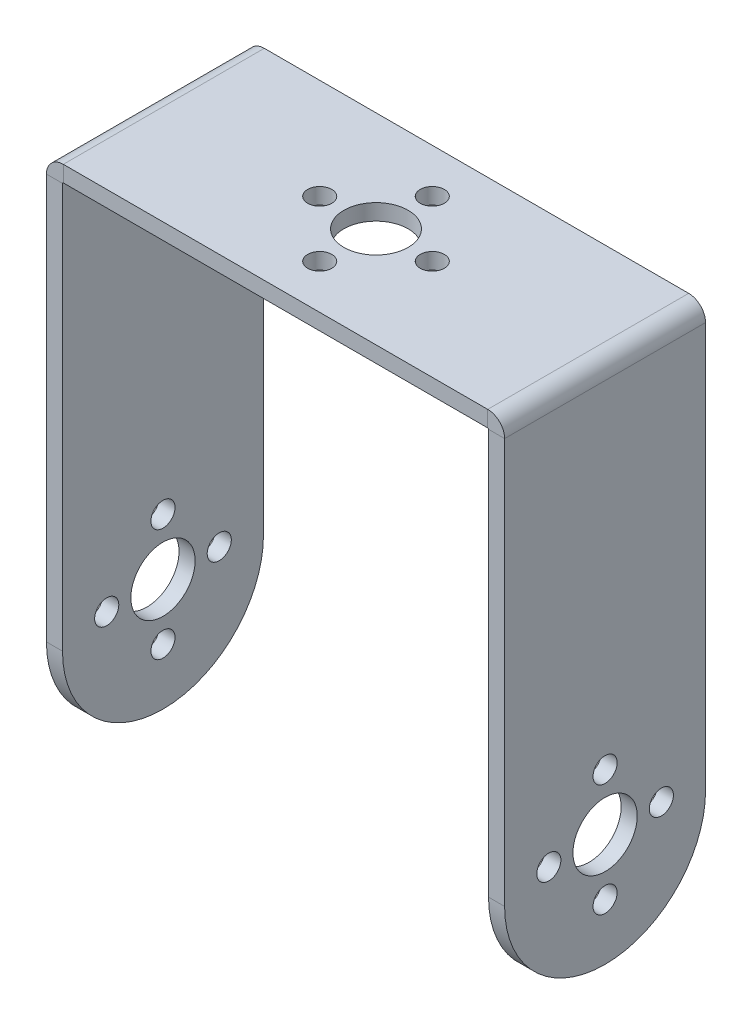
ISO-10303-21;
HEADER;
FILE_DESCRIPTION(('STEP AP214'),'2;1');
FILE_NAME('part.step','',(''),(''),'','','');
FILE_SCHEMA(('AUTOMOTIVE_DESIGN { 1 0 10303 214 1 1 1 1 }'));
ENDSEC;
DATA;
#1=APPLICATION_CONTEXT('core data for automotive mechanical design processes');
#2=APPLICATION_PROTOCOL_DEFINITION('international standard','automotive_design',2000,#1);
#3=PRODUCT_CONTEXT('',#1,'mechanical');
#4=PRODUCT('Part','Part','',(#3));
#5=PRODUCT_RELATED_PRODUCT_CATEGORY('part','',(#4));
#6=PRODUCT_DEFINITION_FORMATION('','',#4);
#7=PRODUCT_DEFINITION_CONTEXT('part definition',#1,'design');
#8=PRODUCT_DEFINITION('design','',#6,#7);
#9=PRODUCT_DEFINITION_SHAPE('','',#8);
#10=(LENGTH_UNIT() NAMED_UNIT(*) SI_UNIT(.MILLI.,.METRE.));
#11=(NAMED_UNIT(*) PLANE_ANGLE_UNIT() SI_UNIT($,.RADIAN.));
#12=(NAMED_UNIT(*) SI_UNIT($,.STERADIAN.) SOLID_ANGLE_UNIT());
#13=UNCERTAINTY_MEASURE_WITH_UNIT(LENGTH_MEASURE(1.E-05),#10,'distance_accuracy_value','');
#14=(GEOMETRIC_REPRESENTATION_CONTEXT(3) GLOBAL_UNCERTAINTY_ASSIGNED_CONTEXT((#13)) GLOBAL_UNIT_ASSIGNED_CONTEXT((#10,
#11,#12)) REPRESENTATION_CONTEXT('',''));
#15=CARTESIAN_POINT('',(0.,0.,0.));
#16=DIRECTION('',(0.,0.,1.));
#17=DIRECTION('',(1.,0.,0.));
#18=AXIS2_PLACEMENT_3D('',#15,#16,#17);
#19=CARTESIAN_POINT('',(-79.925523148209,43.3899538371544,25.));
#20=DIRECTION('',(0.,0.,1.));
#21=DIRECTION('',(1.,0.,0.));
#22=AXIS2_PLACEMENT_3D('',#19,#20,#21);
#23=PLANE('',#22);
#24=DIRECTION('',(0.,-1.,0.));
#25=VECTOR('',#24,1.);
#26=CARTESIAN_POINT('',(-27.025523148209,43.3899538371544,25.));
#27=LINE('',#26,#25);
#28=CARTESIAN_POINT('',(-27.0255231482089,45.3899538371544,25.));
#29=VERTEX_POINT('',#28);
#30=CARTESIAN_POINT('',(-27.025523148209,43.3899538371544,25.));
#31=VERTEX_POINT('',#30);
#32=EDGE_CURVE('E11',#29,#31,#27,.T.);
#33=ORIENTED_EDGE('',*,*,#32,.F.);
#34=DIRECTION('',(1.,0.,0.));
#35=VECTOR('',#34,1.);
#36=CARTESIAN_POINT('',(-79.925523148209,45.3899538371544,25.));
#37=LINE('',#36,#35);
#38=CARTESIAN_POINT('',(-79.825523148209,45.3899538371544,25.));
#39=VERTEX_POINT('',#38);
#40=EDGE_CURVE('E99',#39,#29,#37,.T.);
#41=ORIENTED_EDGE('',*,*,#40,.F.);
#42=DIRECTION('',(0.,-1.,0.));
#43=VECTOR('',#42,1.);
#44=CARTESIAN_POINT('',(-79.825523148209,43.3899538371544,25.));
#45=LINE('',#44,#43);
#46=CARTESIAN_POINT('',(-79.825523148209,43.3899538371544,25.));
#47=VERTEX_POINT('',#46);
#48=EDGE_CURVE('E48',#39,#47,#45,.T.);
#49=ORIENTED_EDGE('',*,*,#48,.T.);
#50=DIRECTION('',(1.,0.,0.));
#51=VECTOR('',#50,1.);
#52=CARTESIAN_POINT('',(-79.925523148209,43.3899538371544,25.));
#53=LINE('',#52,#51);
#54=EDGE_CURVE('E101',#47,#31,#53,.T.);
#55=ORIENTED_EDGE('',*,*,#54,.T.);
#56=EDGE_LOOP('',(#33,#41,#49,#55));
#57=FACE_BOUND('',#56,.T.);
#58=ADVANCED_FACE('F38',(#57),#23,.T.);
#59=CARTESIAN_POINT('',(-79.825523148209,43.2899538371544,25.));
#60=DIRECTION('',(0.,0.,1.));
#61=DIRECTION('',(1.,0.,0.));
#62=AXIS2_PLACEMENT_3D('',#59,#60,#61);
#63=PLANE('',#62);
#64=ORIENTED_EDGE('',*,*,#48,.F.);
#65=CARTESIAN_POINT('',(-79.825523148209,43.2899538371544,25.));
#66=DIRECTION('',(0.,0.,1.));
#67=DIRECTION('',(1.,0.,0.));
#68=AXIS2_PLACEMENT_3D('',#65,#66,#67);
#69=CIRCLE('',#68,2.1);
#70=CARTESIAN_POINT('',(-81.925523148209,43.2899538371544,25.));
#71=VERTEX_POINT('',#70);
#72=EDGE_CURVE('E138',#39,#71,#69,.T.);
#73=ORIENTED_EDGE('',*,*,#72,.T.);
#74=DIRECTION('',(1.,0.,0.));
#75=VECTOR('',#74,1.);
#76=CARTESIAN_POINT('',(-79.925523148209,43.2899538371544,25.));
#77=LINE('',#76,#75);
#78=CARTESIAN_POINT('',(-79.925523148209,43.2899538371544,25.));
#79=VERTEX_POINT('',#78);
#80=EDGE_CURVE('E195',#71,#79,#77,.T.);
#81=ORIENTED_EDGE('',*,*,#80,.T.);
#82=CARTESIAN_POINT('',(-79.825523148209,43.2899538371544,25.));
#83=DIRECTION('',(0.,0.,-1.));
#84=DIRECTION('',(-1.,0.,0.));
#85=AXIS2_PLACEMENT_3D('',#82,#83,#84);
#86=CIRCLE('',#85,0.0999999999999998);
#87=EDGE_CURVE('E216',#47,#79,#86,.F.);
#88=ORIENTED_EDGE('',*,*,#87,.F.);
#89=EDGE_LOOP('',(#64,#73,#81,#88));
#90=FACE_BOUND('',#89,.T.);
#91=ADVANCED_FACE('F217',(#90),#63,.T.);
#92=CARTESIAN_POINT('',(-79.925523148209,43.3899538371544,25.));
#93=DIRECTION('',(0.,0.,1.));
#94=DIRECTION('',(0.,1.,0.));
#95=AXIS2_PLACEMENT_3D('',#92,#93,#94);
#96=PLANE('',#95);
#97=ORIENTED_EDGE('',*,*,#80,.F.);
#98=DIRECTION('',(0.,1.,0.));
#99=VECTOR('',#98,1.);
#100=CARTESIAN_POINT('',(-81.925523148209,43.3899538371544,25.));
#101=LINE('',#100,#99);
#102=CARTESIAN_POINT('',(-81.925523148209,-7.11349741649558,25.));
#103=VERTEX_POINT('',#102);
#104=EDGE_CURVE('E172',#103,#71,#101,.T.);
#105=ORIENTED_EDGE('',*,*,#104,.F.);
#106=DIRECTION('',(1.,0.,0.));
#107=VECTOR('',#106,1.);
#108=CARTESIAN_POINT('',(-79.925523148209,-7.11349741649558,25.));
#109=LINE('',#108,#107);
#110=CARTESIAN_POINT('',(-79.925523148209,-7.11349741649558,25.));
#111=VERTEX_POINT('',#110);
#112=EDGE_CURVE('E192',#103,#111,#109,.T.);
#113=ORIENTED_EDGE('',*,*,#112,.T.);
#114=DIRECTION('',(0.,1.,0.));
#115=VECTOR('',#114,1.);
#116=CARTESIAN_POINT('',(-79.925523148209,43.3899538371544,25.));
#117=LINE('',#116,#115);
#118=EDGE_CURVE('E295',#111,#79,#117,.T.);
#119=ORIENTED_EDGE('',*,*,#118,.T.);
#120=EDGE_LOOP('',(#97,#105,#113,#119));
#121=FACE_BOUND('',#120,.T.);
#122=ADVANCED_FACE('F293',(#121),#96,.T.);
#123=CARTESIAN_POINT('',(-79.925523148209,-7.11349741649558,12.5));
#124=DIRECTION('',(-1.,0.,0.));
#125=DIRECTION('',(0.,0.,1.));
#126=AXIS2_PLACEMENT_3D('',#123,#124,#125);
#127=CYLINDRICAL_SURFACE('',#126,12.5);
#128=ORIENTED_EDGE('',*,*,#112,.F.);
#129=CARTESIAN_POINT('',(-81.925523148209,-7.11349741649558,12.5));
#130=DIRECTION('',(-1.,0.,0.));
#131=DIRECTION('',(0.,0.,1.));
#132=AXIS2_PLACEMENT_3D('',#129,#130,#131);
#133=CIRCLE('',#132,12.5);
#134=CARTESIAN_POINT('',(-81.925523148209,-7.11349741649558,0.));
#135=VERTEX_POINT('',#134);
#136=EDGE_CURVE('E279',#135,#103,#133,.T.);
#137=ORIENTED_EDGE('',*,*,#136,.F.);
#138=DIRECTION('',(1.,0.,0.));
#139=VECTOR('',#138,1.);
#140=CARTESIAN_POINT('',(-79.925523148209,-7.11349741649558,0.));
#141=LINE('',#140,#139);
#142=CARTESIAN_POINT('',(-79.925523148209,-7.11349741649558,0.));
#143=VERTEX_POINT('',#142);
#144=EDGE_CURVE('E189',#135,#143,#141,.T.);
#145=ORIENTED_EDGE('',*,*,#144,.T.);
#146=CARTESIAN_POINT('',(-79.925523148209,-7.11349741649558,12.5));
#147=DIRECTION('',(-1.,0.,0.));
#148=DIRECTION('',(0.,0.,1.));
#149=AXIS2_PLACEMENT_3D('',#146,#147,#148);
#150=CIRCLE('',#149,12.5);
#151=EDGE_CURVE('E301',#143,#111,#150,.T.);
#152=ORIENTED_EDGE('',*,*,#151,.T.);
#153=EDGE_LOOP('',(#128,#137,#145,#152));
#154=FACE_BOUND('',#153,.T.);
#155=ADVANCED_FACE('F508',(#154),#127,.T.);
#156=CARTESIAN_POINT('',(-79.925523148209,43.3899538371544,0.));
#157=DIRECTION('',(0.,0.,1.));
#158=DIRECTION('',(0.,1.,0.));
#159=AXIS2_PLACEMENT_3D('',#156,#157,#158);
#160=PLANE('',#159);
#161=ORIENTED_EDGE('',*,*,#144,.F.);
#162=DIRECTION('',(0.,1.,0.));
#163=VECTOR('',#162,1.);
#164=CARTESIAN_POINT('',(-81.925523148209,43.3899538371544,0.));
#165=LINE('',#164,#163);
#166=CARTESIAN_POINT('',(-81.925523148209,43.2899538371544,0.));
#167=VERTEX_POINT('',#166);
#168=EDGE_CURVE('E256',#135,#167,#165,.T.);
#169=ORIENTED_EDGE('',*,*,#168,.T.);
#170=DIRECTION('',(1.,0.,0.));
#171=VECTOR('',#170,1.);
#172=CARTESIAN_POINT('',(-79.925523148209,43.2899538371544,0.));
#173=LINE('',#172,#171);
#174=CARTESIAN_POINT('',(-79.925523148209,43.2899538371544,0.));
#175=VERTEX_POINT('',#174);
#176=EDGE_CURVE('E186',#167,#175,#173,.T.);
#177=ORIENTED_EDGE('',*,*,#176,.T.);
#178=DIRECTION('',(0.,1.,0.));
#179=VECTOR('',#178,1.);
#180=CARTESIAN_POINT('',(-79.925523148209,43.3899538371544,0.));
#181=LINE('',#180,#179);
#182=EDGE_CURVE('E307',#143,#175,#181,.T.);
#183=ORIENTED_EDGE('',*,*,#182,.F.);
#184=EDGE_LOOP('',(#161,#169,#177,#183));
#185=FACE_BOUND('',#184,.T.);
#186=ADVANCED_FACE('F504',(#185),#160,.F.);
#187=CARTESIAN_POINT('',(-79.825523148209,43.2899538371544,0.));
#188=DIRECTION('',(0.,0.,-1.));
#189=DIRECTION('',(-1.,0.,0.));
#190=AXIS2_PLACEMENT_3D('',#187,#188,#189);
#191=PLANE('',#190);
#192=ORIENTED_EDGE('',*,*,#176,.F.);
#193=CARTESIAN_POINT('',(-79.825523148209,43.2899538371544,0.));
#194=DIRECTION('',(0.,0.,1.));
#195=DIRECTION('',(1.,0.,0.));
#196=AXIS2_PLACEMENT_3D('',#193,#194,#195);
#197=CIRCLE('',#196,2.1);
#198=CARTESIAN_POINT('',(-79.825523148209,45.3899538371544,0.));
#199=VERTEX_POINT('',#198);
#200=EDGE_CURVE('E135',#167,#199,#197,.F.);
#201=ORIENTED_EDGE('',*,*,#200,.T.);
#202=DIRECTION('',(0.,-1.,0.));
#203=VECTOR('',#202,1.);
#204=CARTESIAN_POINT('',(-79.825523148209,43.3899538371544,0.));
#205=LINE('',#204,#203);
#206=CARTESIAN_POINT('',(-79.825523148209,43.3899538371544,0.));
#207=VERTEX_POINT('',#206);
#208=EDGE_CURVE('E183',#199,#207,#205,.T.);
#209=ORIENTED_EDGE('',*,*,#208,.T.);
#210=CARTESIAN_POINT('',(-79.825523148209,43.2899538371544,0.));
#211=DIRECTION('',(0.,0.,1.));
#212=DIRECTION('',(1.,0.,0.));
#213=AXIS2_PLACEMENT_3D('',#210,#211,#212);
#214=CIRCLE('',#213,0.0999999999999998);
#215=EDGE_CURVE('E222',#175,#207,#214,.F.);
#216=ORIENTED_EDGE('',*,*,#215,.F.);
#217=EDGE_LOOP('',(#192,#201,#209,#216));
#218=FACE_BOUND('',#217,.T.);
#219=ADVANCED_FACE('F501',(#218),#191,.T.);
#220=CARTESIAN_POINT('',(-79.925523148209,43.3899538371544,0.));
#221=DIRECTION('',(0.,0.,1.));
#222=DIRECTION('',(1.,0.,0.));
#223=AXIS2_PLACEMENT_3D('',#220,#221,#222);
#224=PLANE('',#223);
#225=ORIENTED_EDGE('',*,*,#208,.F.);
#226=DIRECTION('',(1.,0.,0.));
#227=VECTOR('',#226,1.);
#228=CARTESIAN_POINT('',(-79.925523148209,45.3899538371544,0.));
#229=LINE('',#228,#227);
#230=CARTESIAN_POINT('',(-27.025523148209,45.3899538371544,0.));
#231=VERTEX_POINT('',#230);
#232=EDGE_CURVE('E129',#199,#231,#229,.T.);
#233=ORIENTED_EDGE('',*,*,#232,.T.);
#234=DIRECTION('',(0.,-1.,0.));
#235=VECTOR('',#234,1.);
#236=CARTESIAN_POINT('',(-27.025523148209,43.3899538371544,0.));
#237=LINE('',#236,#235);
#238=CARTESIAN_POINT('',(-27.025523148209,43.3899538371544,0.));
#239=VERTEX_POINT('',#238);
#240=EDGE_CURVE('E56',#231,#239,#237,.T.);
#241=ORIENTED_EDGE('',*,*,#240,.T.);
#242=DIRECTION('',(1.,0.,0.));
#243=VECTOR('',#242,1.);
#244=CARTESIAN_POINT('',(-79.925523148209,43.3899538371544,0.));
#245=LINE('',#244,#243);
#246=EDGE_CURVE('E213',#207,#239,#245,.T.);
#247=ORIENTED_EDGE('',*,*,#246,.F.);
#248=EDGE_LOOP('',(#225,#233,#241,#247));
#249=FACE_BOUND('',#248,.T.);
#250=ADVANCED_FACE('F498',(#249),#224,.F.);
#251=CARTESIAN_POINT('',(-27.025523148209,43.2899538371544,0.));
#252=DIRECTION('',(0.,0.,-1.));
#253=DIRECTION('',(-1.,0.,0.));
#254=AXIS2_PLACEMENT_3D('',#251,#252,#253);
#255=PLANE('',#254);
#256=ORIENTED_EDGE('',*,*,#240,.F.);
#257=CARTESIAN_POINT('',(-27.025523148209,43.2899538371544,0.));
#258=DIRECTION('',(0.,0.,1.));
#259=DIRECTION('',(1.,0.,0.));
#260=AXIS2_PLACEMENT_3D('',#257,#258,#259);
#261=CIRCLE('',#260,2.1);
#262=CARTESIAN_POINT('',(-24.925523148209,43.2899538371544,0.));
#263=VERTEX_POINT('',#262);
#264=EDGE_CURVE('E117',#231,#263,#261,.F.);
#265=ORIENTED_EDGE('',*,*,#264,.T.);
#266=DIRECTION('',(-1.,0.,0.));
#267=VECTOR('',#266,1.);
#268=CARTESIAN_POINT('',(-26.925523148209,43.2899538371544,0.));
#269=LINE('',#268,#267);
#270=CARTESIAN_POINT('',(-26.925523148209,43.2899538371544,0.));
#271=VERTEX_POINT('',#270);
#272=EDGE_CURVE('E179',#263,#271,#269,.T.);
#273=ORIENTED_EDGE('',*,*,#272,.T.);
#274=CARTESIAN_POINT('',(-27.025523148209,43.2899538371544,0.));
#275=DIRECTION('',(0.,0.,1.));
#276=DIRECTION('',(1.,0.,0.));
#277=AXIS2_PLACEMENT_3D('',#274,#275,#276);
#278=CIRCLE('',#277,0.0999999999999998);
#279=EDGE_CURVE('E120',#239,#271,#278,.F.);
#280=ORIENTED_EDGE('',*,*,#279,.F.);
#281=EDGE_LOOP('',(#256,#265,#273,#280));
#282=FACE_BOUND('',#281,.T.);
#283=ADVANCED_FACE('F314',(#282),#255,.T.);
#284=CARTESIAN_POINT('',(-26.925523148209,43.3899538371544,0.));
#285=DIRECTION('',(0.,0.,1.));
#286=DIRECTION('',(0.,-1.,0.));
#287=AXIS2_PLACEMENT_3D('',#284,#285,#286);
#288=PLANE('',#287);
#289=ORIENTED_EDGE('',*,*,#272,.F.);
#290=DIRECTION('',(0.,1.,0.));
#291=VECTOR('',#290,1.);
#292=CARTESIAN_POINT('',(-24.925523148209,43.3899538371544,0.));
#293=LINE('',#292,#291);
#294=CARTESIAN_POINT('',(-24.925523148209,-7.11349741649558,0.));
#295=VERTEX_POINT('',#294);
#296=EDGE_CURVE('E249',#263,#295,#293,.F.);
#297=ORIENTED_EDGE('',*,*,#296,.T.);
#298=DIRECTION('',(-1.,0.,0.));
#299=VECTOR('',#298,1.);
#300=CARTESIAN_POINT('',(-26.925523148209,-7.11349741649558,0.));
#301=LINE('',#300,#299);
#302=CARTESIAN_POINT('',(-26.925523148209,-7.11349741649558,0.));
#303=VERTEX_POINT('',#302);
#304=EDGE_CURVE('E176',#295,#303,#301,.T.);
#305=ORIENTED_EDGE('',*,*,#304,.T.);
#306=DIRECTION('',(0.,-1.,0.));
#307=VECTOR('',#306,1.);
#308=CARTESIAN_POINT('',(-26.925523148209,43.3899538371544,0.));
#309=LINE('',#308,#307);
#310=EDGE_CURVE('E228',#271,#303,#309,.T.);
#311=ORIENTED_EDGE('',*,*,#310,.F.);
#312=EDGE_LOOP('',(#289,#297,#305,#311));
#313=FACE_BOUND('',#312,.T.);
#314=ADVANCED_FACE('F321',(#313),#288,.F.);
#315=CARTESIAN_POINT('',(-26.925523148209,-7.11349741649557,12.5));
#316=DIRECTION('',(1.,0.,0.));
#317=DIRECTION('',(0.,1.,0.));
#318=AXIS2_PLACEMENT_3D('',#315,#316,#317);
#319=CYLINDRICAL_SURFACE('',#318,12.5);
#320=ORIENTED_EDGE('',*,*,#304,.F.);
#321=CARTESIAN_POINT('',(-24.925523148209,-7.11349741649557,12.5));
#322=DIRECTION('',(1.,0.,0.));
#323=DIRECTION('',(0.,1.,0.));
#324=AXIS2_PLACEMENT_3D('',#321,#322,#323);
#325=CIRCLE('',#324,12.5);
#326=CARTESIAN_POINT('',(-24.925523148209,-7.11349741649557,25.));
#327=VERTEX_POINT('',#326);
#328=EDGE_CURVE('E268',#327,#295,#325,.T.);
#329=ORIENTED_EDGE('',*,*,#328,.F.);
#330=DIRECTION('',(-1.,0.,0.));
#331=VECTOR('',#330,1.);
#332=CARTESIAN_POINT('',(-26.925523148209,-7.11349741649557,25.));
#333=LINE('',#332,#331);
#334=CARTESIAN_POINT('',(-26.925523148209,-7.11349741649557,25.));
#335=VERTEX_POINT('',#334);
#336=EDGE_CURVE('E173',#327,#335,#333,.T.);
#337=ORIENTED_EDGE('',*,*,#336,.T.);
#338=CARTESIAN_POINT('',(-26.925523148209,-7.11349741649557,12.5));
#339=DIRECTION('',(1.,0.,0.));
#340=DIRECTION('',(0.,1.,0.));
#341=AXIS2_PLACEMENT_3D('',#338,#339,#340);
#342=CIRCLE('',#341,12.5);
#343=EDGE_CURVE('E330',#335,#303,#342,.T.);
#344=ORIENTED_EDGE('',*,*,#343,.T.);
#345=EDGE_LOOP('',(#320,#329,#337,#344));
#346=FACE_BOUND('',#345,.T.);
#347=ADVANCED_FACE('F490',(#346),#319,.T.);
#348=CARTESIAN_POINT('',(-26.925523148209,43.3899538371544,25.));
#349=DIRECTION('',(0.,0.,1.));
#350=DIRECTION('',(0.,-1.,0.));
#351=AXIS2_PLACEMENT_3D('',#348,#349,#350);
#352=PLANE('',#351);
#353=ORIENTED_EDGE('',*,*,#336,.F.);
#354=DIRECTION('',(0.,1.,0.));
#355=VECTOR('',#354,1.);
#356=CARTESIAN_POINT('',(-24.925523148209,43.3899538371544,25.));
#357=LINE('',#356,#355);
#358=CARTESIAN_POINT('',(-24.925523148209,43.2899538371544,25.));
#359=VERTEX_POINT('',#358);
#360=EDGE_CURVE('E269',#359,#327,#357,.F.);
#361=ORIENTED_EDGE('',*,*,#360,.F.);
#362=DIRECTION('',(-1.,0.,0.));
#363=VECTOR('',#362,1.);
#364=CARTESIAN_POINT('',(-26.925523148209,43.2899538371544,25.));
#365=LINE('',#364,#363);
#366=CARTESIAN_POINT('',(-26.925523148209,43.2899538371544,25.));
#367=VERTEX_POINT('',#366);
#368=EDGE_CURVE('E42',#359,#367,#365,.T.);
#369=ORIENTED_EDGE('',*,*,#368,.T.);
#370=DIRECTION('',(0.,-1.,0.));
#371=VECTOR('',#370,1.);
#372=CARTESIAN_POINT('',(-26.925523148209,43.3899538371544,25.));
#373=LINE('',#372,#371);
#374=EDGE_CURVE('E234',#367,#335,#373,.T.);
#375=ORIENTED_EDGE('',*,*,#374,.T.);
#376=EDGE_LOOP('',(#353,#361,#369,#375));
#377=FACE_BOUND('',#376,.T.);
#378=ADVANCED_FACE('F386',(#377),#352,.T.);
#379=CARTESIAN_POINT('',(-60.4255230999999,43.3899538371544,12.5000001868561));
#380=DIRECTION('',(0.,1.,0.));
#381=DIRECTION('',(0.,0.,1.));
#382=AXIS2_PLACEMENT_3D('',#379,#380,#381);
#383=CYLINDRICAL_SURFACE('',#382,1.5);
#384=CARTESIAN_POINT('',(-60.4255230999999,43.3899538371544,12.5000001868561));
#385=DIRECTION('',(0.,1.,0.));
#386=DIRECTION('',(0.,0.,1.));
#387=AXIS2_PLACEMENT_3D('',#384,#385,#386);
#388=CIRCLE('',#387,1.5);
#389=CARTESIAN_POINT('',(-60.4255230999999,43.3899538371544,14.0000001868561));
#390=VERTEX_POINT('',#389);
#391=EDGE_CURVE('E221',#390,#390,#388,.T.);
#392=ORIENTED_EDGE('',*,*,#391,.F.);
#393=EDGE_LOOP('',(#392));
#394=FACE_BOUND('',#393,.T.);
#395=CARTESIAN_POINT('',(-60.4255230999999,45.3899538371544,12.5000001868561));
#396=DIRECTION('',(0.,1.,0.));
#397=DIRECTION('',(0.,0.,1.));
#398=AXIS2_PLACEMENT_3D('',#395,#396,#397);
#399=CIRCLE('',#398,1.5);
#400=CARTESIAN_POINT('',(-60.4255230999999,45.3899538371544,14.0000001868561));
#401=VERTEX_POINT('',#400);
#402=EDGE_CURVE('E143',#401,#401,#399,.T.);
#403=ORIENTED_EDGE('',*,*,#402,.T.);
#404=EDGE_LOOP('',(#403));
#405=FACE_BOUND('',#404,.T.);
#406=ADVANCED_FACE('F382',(#394,#405),#383,.F.);
#407=CARTESIAN_POINT('',(-53.4255217787956,43.3899538371544,19.4999988656515));
#408=DIRECTION('',(0.,1.,0.));
#409=DIRECTION('',(0.,0.,1.));
#410=AXIS2_PLACEMENT_3D('',#407,#408,#409);
#411=CYLINDRICAL_SURFACE('',#410,1.5);
#412=CARTESIAN_POINT('',(-53.4255217787956,43.3899538371544,19.4999988656515));
#413=DIRECTION('',(0.,1.,0.));
#414=DIRECTION('',(0.,0.,1.));
#415=AXIS2_PLACEMENT_3D('',#412,#413,#414);
#416=CIRCLE('',#415,1.5);
#417=CARTESIAN_POINT('',(-53.4255217787956,43.3899538371544,20.9999988656515));
#418=VERTEX_POINT('',#417);
#419=EDGE_CURVE('E374',#418,#418,#416,.T.);
#420=ORIENTED_EDGE('',*,*,#419,.F.);
#421=EDGE_LOOP('',(#420));
#422=FACE_BOUND('',#421,.T.);
#423=CARTESIAN_POINT('',(-53.4255217787956,45.3899538371544,19.4999988656515));
#424=DIRECTION('',(0.,1.,0.));
#425=DIRECTION('',(0.,0.,1.));
#426=AXIS2_PLACEMENT_3D('',#423,#424,#425);
#427=CIRCLE('',#426,1.5);
#428=CARTESIAN_POINT('',(-53.4255217787956,45.3899538371544,20.9999988656515));
#429=VERTEX_POINT('',#428);
#430=EDGE_CURVE('E146',#429,#429,#427,.T.);
#431=ORIENTED_EDGE('',*,*,#430,.T.);
#432=EDGE_LOOP('',(#431));
#433=FACE_BOUND('',#432,.T.);
#434=ADVANCED_FACE('F385',(#422,#433),#411,.F.);
#435=CARTESIAN_POINT('',(-46.4255231000001,43.3899538371544,12.4999975444472));
#436=DIRECTION('',(0.,1.,0.));
#437=DIRECTION('',(0.,0.,1.));
#438=AXIS2_PLACEMENT_3D('',#435,#436,#437);
#439=CYLINDRICAL_SURFACE('',#438,1.5);
#440=CARTESIAN_POINT('',(-46.4255231000001,43.3899538371544,12.4999975444472));
#441=DIRECTION('',(0.,1.,0.));
#442=DIRECTION('',(0.,0.,1.));
#443=AXIS2_PLACEMENT_3D('',#440,#441,#442);
#444=CIRCLE('',#443,1.5);
#445=CARTESIAN_POINT('',(-46.4255231000001,43.3899538371544,13.9999975444472));
#446=VERTEX_POINT('',#445);
#447=EDGE_CURVE('E371',#446,#446,#444,.T.);
#448=ORIENTED_EDGE('',*,*,#447,.F.);
#449=EDGE_LOOP('',(#448));
#450=FACE_BOUND('',#449,.T.);
#451=CARTESIAN_POINT('',(-46.4255231000001,45.3899538371544,12.4999975444472));
#452=DIRECTION('',(0.,1.,0.));
#453=DIRECTION('',(0.,0.,1.));
#454=AXIS2_PLACEMENT_3D('',#451,#452,#453);
#455=CIRCLE('',#454,1.5);
#456=CARTESIAN_POINT('',(-46.4255231000001,45.3899538371544,13.9999975444472));
#457=VERTEX_POINT('',#456);
#458=EDGE_CURVE('E149',#457,#457,#455,.T.);
#459=ORIENTED_EDGE('',*,*,#458,.T.);
#460=EDGE_LOOP('',(#459));
#461=FACE_BOUND('',#460,.T.);
#462=ADVANCED_FACE('F414',(#450,#461),#439,.F.);
#463=CARTESIAN_POINT('',(-53.4255244212044,43.3899538371544,5.49999886565177));
#464=DIRECTION('',(0.,1.,0.));
#465=DIRECTION('',(0.,0.,1.));
#466=AXIS2_PLACEMENT_3D('',#463,#464,#465);
#467=CYLINDRICAL_SURFACE('',#466,1.5);
#468=CARTESIAN_POINT('',(-53.4255244212044,43.3899538371544,5.49999886565177));
#469=DIRECTION('',(0.,1.,0.));
#470=DIRECTION('',(0.,0.,1.));
#471=AXIS2_PLACEMENT_3D('',#468,#469,#470);
#472=CIRCLE('',#471,1.5);
#473=CARTESIAN_POINT('',(-53.4255244212044,43.3899538371544,6.99999886565178));
#474=VERTEX_POINT('',#473);
#475=EDGE_CURVE('E368',#474,#474,#472,.T.);
#476=ORIENTED_EDGE('',*,*,#475,.F.);
#477=EDGE_LOOP('',(#476));
#478=FACE_BOUND('',#477,.T.);
#479=CARTESIAN_POINT('',(-53.4255244212044,45.3899538371544,5.49999886565177));
#480=DIRECTION('',(0.,1.,0.));
#481=DIRECTION('',(0.,0.,1.));
#482=AXIS2_PLACEMENT_3D('',#479,#480,#481);
#483=CIRCLE('',#482,1.5);
#484=CARTESIAN_POINT('',(-53.4255244212044,45.3899538371544,6.99999886565178));
#485=VERTEX_POINT('',#484);
#486=EDGE_CURVE('E152',#485,#485,#483,.T.);
#487=ORIENTED_EDGE('',*,*,#486,.T.);
#488=EDGE_LOOP('',(#487));
#489=FACE_BOUND('',#488,.T.);
#490=ADVANCED_FACE('F404',(#478,#489),#467,.F.);
#491=CARTESIAN_POINT('',(-53.425523148209,43.3899538371544,12.5));
#492=DIRECTION('',(0.,1.,0.));
#493=DIRECTION('',(0.,0.,1.));
#494=AXIS2_PLACEMENT_3D('',#491,#492,#493);
#495=CYLINDRICAL_SURFACE('',#494,4.00000000000001);
#496=CARTESIAN_POINT('',(-53.425523148209,43.3899538371544,12.5));
#497=DIRECTION('',(0.,1.,0.));
#498=DIRECTION('',(0.,0.,1.));
#499=AXIS2_PLACEMENT_3D('',#496,#497,#498);
#500=CIRCLE('',#499,4.00000000000001);
#501=CARTESIAN_POINT('',(-53.425523148209,43.3899538371544,16.5));
#502=VERTEX_POINT('',#501);
#503=EDGE_CURVE('E365',#502,#502,#500,.T.);
#504=ORIENTED_EDGE('',*,*,#503,.F.);
#505=EDGE_LOOP('',(#504));
#506=FACE_BOUND('',#505,.T.);
#507=CARTESIAN_POINT('',(-53.425523148209,45.3899538371544,12.5));
#508=DIRECTION('',(0.,1.,0.));
#509=DIRECTION('',(0.,0.,1.));
#510=AXIS2_PLACEMENT_3D('',#507,#508,#509);
#511=CIRCLE('',#510,4.00000000000001);
#512=CARTESIAN_POINT('',(-53.425523148209,45.3899538371544,16.5));
#513=VERTEX_POINT('',#512);
#514=EDGE_CURVE('E155',#513,#513,#511,.T.);
#515=ORIENTED_EDGE('',*,*,#514,.T.);
#516=EDGE_LOOP('',(#515));
#517=FACE_BOUND('',#516,.T.);
#518=ADVANCED_FACE('F401',(#506,#517),#495,.F.);
#519=CARTESIAN_POINT('',(-79.925523148209,-12.6135015642767,12.5));
#520=DIRECTION('',(-1.,0.,0.));
#521=DIRECTION('',(0.,0.,1.));
#522=AXIS2_PLACEMENT_3D('',#519,#520,#521);
#523=CYLINDRICAL_SURFACE('',#522,1.5);
#524=CARTESIAN_POINT('',(-79.925523148209,-12.6135015642767,12.5));
#525=DIRECTION('',(-1.,0.,0.));
#526=DIRECTION('',(0.,0.,1.));
#527=AXIS2_PLACEMENT_3D('',#524,#525,#526);
#528=CIRCLE('',#527,1.5);
#529=CARTESIAN_POINT('',(-79.925523148209,-12.6135015642767,14.));
#530=VERTEX_POINT('',#529);
#531=EDGE_CURVE('E212',#530,#530,#528,.T.);
#532=ORIENTED_EDGE('',*,*,#531,.F.);
#533=EDGE_LOOP('',(#532));
#534=FACE_BOUND('',#533,.T.);
#535=CARTESIAN_POINT('',(-81.925523148209,-12.6135015642767,12.5));
#536=DIRECTION('',(-1.,0.,0.));
#537=DIRECTION('',(0.,0.,1.));
#538=AXIS2_PLACEMENT_3D('',#535,#536,#537);
#539=CIRCLE('',#538,1.5);
#540=CARTESIAN_POINT('',(-81.925523148209,-12.6135015642767,14.));
#541=VERTEX_POINT('',#540);
#542=EDGE_CURVE('E128',#541,#541,#539,.T.);
#543=ORIENTED_EDGE('',*,*,#542,.T.);
#544=EDGE_LOOP('',(#543));
#545=FACE_BOUND('',#544,.T.);
#546=ADVANCED_FACE('F403',(#534,#545),#523,.F.);
#547=CARTESIAN_POINT('',(-79.925523148209,-5.61350156427672,5.5));
#548=DIRECTION('',(-1.,0.,0.));
#549=DIRECTION('',(0.,0.,1.));
#550=AXIS2_PLACEMENT_3D('',#547,#548,#549);
#551=CYLINDRICAL_SURFACE('',#550,1.5);
#552=CARTESIAN_POINT('',(-79.925523148209,-5.61350156427672,5.5));
#553=DIRECTION('',(-1.,0.,0.));
#554=DIRECTION('',(0.,0.,1.));
#555=AXIS2_PLACEMENT_3D('',#552,#553,#554);
#556=CIRCLE('',#555,1.5);
#557=CARTESIAN_POINT('',(-79.925523148209,-5.61350156427672,7.));
#558=VERTEX_POINT('',#557);
#559=EDGE_CURVE('E359',#558,#558,#556,.T.);
#560=ORIENTED_EDGE('',*,*,#559,.F.);
#561=EDGE_LOOP('',(#560));
#562=FACE_BOUND('',#561,.T.);
#563=CARTESIAN_POINT('',(-81.925523148209,-5.61350156427672,5.5));
#564=DIRECTION('',(-1.,0.,0.));
#565=DIRECTION('',(0.,0.,1.));
#566=AXIS2_PLACEMENT_3D('',#563,#564,#565);
#567=CIRCLE('',#566,1.5);
#568=CARTESIAN_POINT('',(-81.925523148209,-5.61350156427672,7.));
#569=VERTEX_POINT('',#568);
#570=EDGE_CURVE('E160',#569,#569,#567,.T.);
#571=ORIENTED_EDGE('',*,*,#570,.T.);
#572=EDGE_LOOP('',(#571));
#573=FACE_BOUND('',#572,.T.);
#574=ADVANCED_FACE('F411',(#562,#573),#551,.F.);
#575=CARTESIAN_POINT('',(-79.925523148209,1.38649843572328,12.5));
#576=DIRECTION('',(-1.,0.,0.));
#577=DIRECTION('',(0.,0.,1.));
#578=AXIS2_PLACEMENT_3D('',#575,#576,#577);
#579=CYLINDRICAL_SURFACE('',#578,1.5);
#580=CARTESIAN_POINT('',(-79.925523148209,1.38649843572328,12.5));
#581=DIRECTION('',(-1.,0.,0.));
#582=DIRECTION('',(0.,0.,1.));
#583=AXIS2_PLACEMENT_3D('',#580,#581,#582);
#584=CIRCLE('',#583,1.5);
#585=CARTESIAN_POINT('',(-79.925523148209,1.38649843572328,14.));
#586=VERTEX_POINT('',#585);
#587=EDGE_CURVE('E356',#586,#586,#584,.T.);
#588=ORIENTED_EDGE('',*,*,#587,.F.);
#589=EDGE_LOOP('',(#588));
#590=FACE_BOUND('',#589,.T.);
#591=CARTESIAN_POINT('',(-81.925523148209,1.38649843572328,12.5));
#592=DIRECTION('',(-1.,0.,0.));
#593=DIRECTION('',(0.,0.,1.));
#594=AXIS2_PLACEMENT_3D('',#591,#592,#593);
#595=CIRCLE('',#594,1.5);
#596=CARTESIAN_POINT('',(-81.925523148209,1.38649843572328,14.));
#597=VERTEX_POINT('',#596);
#598=EDGE_CURVE('E163',#597,#597,#595,.T.);
#599=ORIENTED_EDGE('',*,*,#598,.T.);
#600=EDGE_LOOP('',(#599));
#601=FACE_BOUND('',#600,.T.);
#602=ADVANCED_FACE('F590',(#590,#601),#579,.F.);
#603=CARTESIAN_POINT('',(-79.925523148209,-5.61350156427672,19.5));
#604=DIRECTION('',(-1.,0.,0.));
#605=DIRECTION('',(0.,0.,1.));
#606=AXIS2_PLACEMENT_3D('',#603,#604,#605);
#607=CYLINDRICAL_SURFACE('',#606,1.5);
#608=CARTESIAN_POINT('',(-79.925523148209,-5.61350156427672,19.5));
#609=DIRECTION('',(-1.,0.,0.));
#610=DIRECTION('',(0.,0.,1.));
#611=AXIS2_PLACEMENT_3D('',#608,#609,#610);
#612=CIRCLE('',#611,1.5);
#613=CARTESIAN_POINT('',(-79.925523148209,-5.61350156427672,21.));
#614=VERTEX_POINT('',#613);
#615=EDGE_CURVE('E353',#614,#614,#612,.T.);
#616=ORIENTED_EDGE('',*,*,#615,.F.);
#617=EDGE_LOOP('',(#616));
#618=FACE_BOUND('',#617,.T.);
#619=CARTESIAN_POINT('',(-81.925523148209,-5.61350156427672,19.5));
#620=DIRECTION('',(-1.,0.,0.));
#621=DIRECTION('',(0.,0.,1.));
#622=AXIS2_PLACEMENT_3D('',#619,#620,#621);
#623=CIRCLE('',#622,1.5);
#624=CARTESIAN_POINT('',(-81.925523148209,-5.61350156427672,21.));
#625=VERTEX_POINT('',#624);
#626=EDGE_CURVE('E166',#625,#625,#623,.T.);
#627=ORIENTED_EDGE('',*,*,#626,.T.);
#628=EDGE_LOOP('',(#627));
#629=FACE_BOUND('',#628,.T.);
#630=ADVANCED_FACE('F601',(#618,#629),#607,.F.);
#631=CARTESIAN_POINT('',(-79.925523148209,-5.61349741649557,12.5));
#632=DIRECTION('',(-1.,0.,0.));
#633=DIRECTION('',(0.,0.,1.));
#634=AXIS2_PLACEMENT_3D('',#631,#632,#633);
#635=CYLINDRICAL_SURFACE('',#634,4.);
#636=CARTESIAN_POINT('',(-79.925523148209,-5.61349741649557,12.5));
#637=DIRECTION('',(-1.,0.,0.));
#638=DIRECTION('',(0.,0.,1.));
#639=AXIS2_PLACEMENT_3D('',#636,#637,#638);
#640=CIRCLE('',#639,4.);
#641=CARTESIAN_POINT('',(-79.925523148209,-5.61349741649557,16.5));
#642=VERTEX_POINT('',#641);
#643=EDGE_CURVE('E302',#642,#642,#640,.T.);
#644=ORIENTED_EDGE('',*,*,#643,.F.);
#645=EDGE_LOOP('',(#644));
#646=FACE_BOUND('',#645,.T.);
#647=CARTESIAN_POINT('',(-81.925523148209,-5.61349741649557,12.5));
#648=DIRECTION('',(-1.,0.,0.));
#649=DIRECTION('',(0.,0.,1.));
#650=AXIS2_PLACEMENT_3D('',#647,#648,#649);
#651=CIRCLE('',#650,4.);
#652=CARTESIAN_POINT('',(-81.925523148209,-5.61349741649557,16.5));
#653=VERTEX_POINT('',#652);
#654=EDGE_CURVE('E169',#653,#653,#651,.T.);
#655=ORIENTED_EDGE('',*,*,#654,.T.);
#656=EDGE_LOOP('',(#655));
#657=FACE_BOUND('',#656,.T.);
#658=ADVANCED_FACE('F40',(#646,#657),#635,.F.);
#659=CARTESIAN_POINT('',(-26.925523148209,-12.6135015642767,12.5));
#660=DIRECTION('',(1.,0.,0.));
#661=DIRECTION('',(0.,1.,0.));
#662=AXIS2_PLACEMENT_3D('',#659,#660,#661);
#663=CYLINDRICAL_SURFACE('',#662,1.5);
#664=CARTESIAN_POINT('',(-26.925523148209,-12.6135015642767,12.5));
#665=DIRECTION('',(1.,0.,0.));
#666=DIRECTION('',(0.,1.,0.));
#667=AXIS2_PLACEMENT_3D('',#664,#665,#666);
#668=CIRCLE('',#667,1.5);
#669=CARTESIAN_POINT('',(-26.925523148209,-11.1135015642767,12.5));
#670=VERTEX_POINT('',#669);
#671=EDGE_CURVE('E346',#670,#670,#668,.T.);
#672=ORIENTED_EDGE('',*,*,#671,.F.);
#673=EDGE_LOOP('',(#672));
#674=FACE_BOUND('',#673,.T.);
#675=CARTESIAN_POINT('',(-24.925523148209,-12.6135015642767,12.5));
#676=DIRECTION('',(1.,0.,0.));
#677=DIRECTION('',(0.,1.,0.));
#678=AXIS2_PLACEMENT_3D('',#675,#676,#677);
#679=CIRCLE('',#678,1.5);
#680=CARTESIAN_POINT('',(-24.925523148209,-11.1135015642767,12.5));
#681=VERTEX_POINT('',#680);
#682=EDGE_CURVE('E252',#681,#681,#679,.T.);
#683=ORIENTED_EDGE('',*,*,#682,.T.);
#684=EDGE_LOOP('',(#683));
#685=FACE_BOUND('',#684,.T.);
#686=ADVANCED_FACE('F469',(#674,#685),#663,.F.);
#687=CARTESIAN_POINT('',(-26.925523148209,-5.6135015642767,5.5));
#688=DIRECTION('',(1.,0.,0.));
#689=DIRECTION('',(0.,1.,0.));
#690=AXIS2_PLACEMENT_3D('',#687,#688,#689);
#691=CYLINDRICAL_SURFACE('',#690,1.5);
#692=CARTESIAN_POINT('',(-26.925523148209,-5.6135015642767,5.5));
#693=DIRECTION('',(1.,0.,0.));
#694=DIRECTION('',(0.,1.,0.));
#695=AXIS2_PLACEMENT_3D('',#692,#693,#694);
#696=CIRCLE('',#695,1.5);
#697=CARTESIAN_POINT('',(-26.925523148209,-4.1135015642767,5.5));
#698=VERTEX_POINT('',#697);
#699=EDGE_CURVE('E343',#698,#698,#696,.T.);
#700=ORIENTED_EDGE('',*,*,#699,.F.);
#701=EDGE_LOOP('',(#700));
#702=FACE_BOUND('',#701,.T.);
#703=CARTESIAN_POINT('',(-24.925523148209,-5.6135015642767,5.5));
#704=DIRECTION('',(1.,0.,0.));
#705=DIRECTION('',(0.,1.,0.));
#706=AXIS2_PLACEMENT_3D('',#703,#704,#705);
#707=CIRCLE('',#706,1.5);
#708=CARTESIAN_POINT('',(-24.925523148209,-4.1135015642767,5.5));
#709=VERTEX_POINT('',#708);
#710=EDGE_CURVE('E255',#709,#709,#707,.T.);
#711=ORIENTED_EDGE('',*,*,#710,.T.);
#712=EDGE_LOOP('',(#711));
#713=FACE_BOUND('',#712,.T.);
#714=ADVANCED_FACE('F472',(#702,#713),#691,.F.);
#715=CARTESIAN_POINT('',(-26.925523148209,1.3864984357233,12.5));
#716=DIRECTION('',(1.,0.,0.));
#717=DIRECTION('',(0.,1.,0.));
#718=AXIS2_PLACEMENT_3D('',#715,#716,#717);
#719=CYLINDRICAL_SURFACE('',#718,1.5);
#720=CARTESIAN_POINT('',(-26.925523148209,1.3864984357233,12.5));
#721=DIRECTION('',(1.,0.,0.));
#722=DIRECTION('',(0.,1.,0.));
#723=AXIS2_PLACEMENT_3D('',#720,#721,#722);
#724=CIRCLE('',#723,1.5);
#725=CARTESIAN_POINT('',(-26.925523148209,2.88649843572329,12.5));
#726=VERTEX_POINT('',#725);
#727=EDGE_CURVE('E340',#726,#726,#724,.T.);
#728=ORIENTED_EDGE('',*,*,#727,.F.);
#729=EDGE_LOOP('',(#728));
#730=FACE_BOUND('',#729,.T.);
#731=CARTESIAN_POINT('',(-24.925523148209,1.3864984357233,12.5));
#732=DIRECTION('',(1.,0.,0.));
#733=DIRECTION('',(0.,1.,0.));
#734=AXIS2_PLACEMENT_3D('',#731,#732,#733);
#735=CIRCLE('',#734,1.5);
#736=CARTESIAN_POINT('',(-24.925523148209,2.88649843572329,12.5));
#737=VERTEX_POINT('',#736);
#738=EDGE_CURVE('E259',#737,#737,#735,.T.);
#739=ORIENTED_EDGE('',*,*,#738,.T.);
#740=EDGE_LOOP('',(#739));
#741=FACE_BOUND('',#740,.T.);
#742=ADVANCED_FACE('F476',(#730,#741),#719,.F.);
#743=CARTESIAN_POINT('',(-26.925523148209,-5.6135015642767,19.5));
#744=DIRECTION('',(1.,0.,0.));
#745=DIRECTION('',(0.,1.,0.));
#746=AXIS2_PLACEMENT_3D('',#743,#744,#745);
#747=CYLINDRICAL_SURFACE('',#746,1.5);
#748=CARTESIAN_POINT('',(-26.925523148209,-5.6135015642767,19.5));
#749=DIRECTION('',(1.,0.,0.));
#750=DIRECTION('',(0.,1.,0.));
#751=AXIS2_PLACEMENT_3D('',#748,#749,#750);
#752=CIRCLE('',#751,1.5);
#753=CARTESIAN_POINT('',(-26.925523148209,-4.1135015642767,19.5));
#754=VERTEX_POINT('',#753);
#755=EDGE_CURVE('E337',#754,#754,#752,.T.);
#756=ORIENTED_EDGE('',*,*,#755,.F.);
#757=EDGE_LOOP('',(#756));
#758=FACE_BOUND('',#757,.T.);
#759=CARTESIAN_POINT('',(-24.925523148209,-5.6135015642767,19.5));
#760=DIRECTION('',(1.,0.,0.));
#761=DIRECTION('',(0.,1.,0.));
#762=AXIS2_PLACEMENT_3D('',#759,#760,#761);
#763=CIRCLE('',#762,1.5);
#764=CARTESIAN_POINT('',(-24.925523148209,-4.1135015642767,19.5));
#765=VERTEX_POINT('',#764);
#766=EDGE_CURVE('E262',#765,#765,#763,.T.);
#767=ORIENTED_EDGE('',*,*,#766,.T.);
#768=EDGE_LOOP('',(#767));
#769=FACE_BOUND('',#768,.T.);
#770=ADVANCED_FACE('F480',(#758,#769),#747,.F.);
#771=CARTESIAN_POINT('',(-26.925523148209,-5.61349741649556,12.5));
#772=DIRECTION('',(1.,0.,0.));
#773=DIRECTION('',(0.,1.,0.));
#774=AXIS2_PLACEMENT_3D('',#771,#772,#773);
#775=CYLINDRICAL_SURFACE('',#774,4.);
#776=CARTESIAN_POINT('',(-26.925523148209,-5.61349741649556,12.5));
#777=DIRECTION('',(1.,0.,0.));
#778=DIRECTION('',(0.,1.,0.));
#779=AXIS2_PLACEMENT_3D('',#776,#777,#778);
#780=CIRCLE('',#779,4.);
#781=CARTESIAN_POINT('',(-26.925523148209,-1.61349741649556,12.5));
#782=VERTEX_POINT('',#781);
#783=EDGE_CURVE('E332',#782,#782,#780,.T.);
#784=ORIENTED_EDGE('',*,*,#783,.F.);
#785=EDGE_LOOP('',(#784));
#786=FACE_BOUND('',#785,.T.);
#787=CARTESIAN_POINT('',(-24.925523148209,-5.61349741649556,12.5));
#788=DIRECTION('',(1.,0.,0.));
#789=DIRECTION('',(0.,1.,0.));
#790=AXIS2_PLACEMENT_3D('',#787,#788,#789);
#791=CIRCLE('',#790,4.);
#792=CARTESIAN_POINT('',(-24.925523148209,-1.61349741649556,12.5));
#793=VERTEX_POINT('',#792);
#794=EDGE_CURVE('E265',#793,#793,#791,.T.);
#795=ORIENTED_EDGE('',*,*,#794,.T.);
#796=EDGE_LOOP('',(#795));
#797=FACE_BOUND('',#796,.T.);
#798=ADVANCED_FACE('F427',(#786,#797),#775,.F.);
#799=CARTESIAN_POINT('',(-27.025523148209,43.2899538371544,25.));
#800=DIRECTION('',(0.,0.,1.));
#801=DIRECTION('',(1.,0.,0.));
#802=AXIS2_PLACEMENT_3D('',#799,#800,#801);
#803=PLANE('',#802);
#804=CARTESIAN_POINT('',(-27.025523148209,43.2899538371544,25.));
#805=DIRECTION('',(0.,0.,1.));
#806=DIRECTION('',(1.,0.,0.));
#807=AXIS2_PLACEMENT_3D('',#804,#805,#806);
#808=CIRCLE('',#807,2.1);
#809=EDGE_CURVE('E114',#359,#29,#808,.T.);
#810=ORIENTED_EDGE('',*,*,#809,.T.);
#811=ORIENTED_EDGE('',*,*,#32,.T.);
#812=CARTESIAN_POINT('',(-27.025523148209,43.2899538371544,25.));
#813=DIRECTION('',(0.,0.,-1.));
#814=DIRECTION('',(-1.,0.,0.));
#815=AXIS2_PLACEMENT_3D('',#812,#813,#814);
#816=CIRCLE('',#815,0.0999999999999998);
#817=EDGE_CURVE('E238',#367,#31,#816,.F.);
#818=ORIENTED_EDGE('',*,*,#817,.F.);
#819=ORIENTED_EDGE('',*,*,#368,.F.);
#820=EDGE_LOOP('',(#810,#811,#818,#819));
#821=FACE_BOUND('',#820,.T.);
#822=ADVANCED_FACE('F132',(#821),#803,.T.);
#823=CARTESIAN_POINT('',(-26.925523148209,43.3899538371544,25.));
#824=DIRECTION('',(1.,0.,0.));
#825=DIRECTION('',(0.,1.,0.));
#826=AXIS2_PLACEMENT_3D('',#823,#824,#825);
#827=PLANE('',#826);
#828=ORIENTED_EDGE('',*,*,#671,.T.);
#829=EDGE_LOOP('',(#828));
#830=FACE_BOUND('',#829,.T.);
#831=ORIENTED_EDGE('',*,*,#699,.T.);
#832=EDGE_LOOP('',(#831));
#833=FACE_BOUND('',#832,.T.);
#834=ORIENTED_EDGE('',*,*,#727,.T.);
#835=EDGE_LOOP('',(#834));
#836=FACE_BOUND('',#835,.T.);
#837=ORIENTED_EDGE('',*,*,#755,.T.);
#838=EDGE_LOOP('',(#837));
#839=FACE_BOUND('',#838,.T.);
#840=ORIENTED_EDGE('',*,*,#783,.T.);
#841=EDGE_LOOP('',(#840));
#842=FACE_BOUND('',#841,.T.);
#843=ORIENTED_EDGE('',*,*,#374,.F.);
#844=DIRECTION('',(0.,0.,-1.));
#845=VECTOR('',#844,1.);
#846=CARTESIAN_POINT('',(-26.925523148209,43.2899538371544,0.));
#847=LINE('',#846,#845);
#848=EDGE_CURVE('E231',#367,#271,#847,.T.);
#849=ORIENTED_EDGE('',*,*,#848,.T.);
#850=ORIENTED_EDGE('',*,*,#310,.T.);
#851=ORIENTED_EDGE('',*,*,#343,.F.);
#852=EDGE_LOOP('',(#843,#849,#850,#851));
#853=FACE_BOUND('',#852,.T.);
#854=ADVANCED_FACE('F327',(#830,#833,#836,#839,#842,#853),#827,.F.);
#855=CARTESIAN_POINT('',(-79.925523148209,43.3899538371544,25.));
#856=DIRECTION('',(-1.,0.,0.));
#857=DIRECTION('',(0.,0.,1.));
#858=AXIS2_PLACEMENT_3D('',#855,#856,#857);
#859=PLANE('',#858);
#860=ORIENTED_EDGE('',*,*,#531,.T.);
#861=EDGE_LOOP('',(#860));
#862=FACE_BOUND('',#861,.T.);
#863=ORIENTED_EDGE('',*,*,#559,.T.);
#864=EDGE_LOOP('',(#863));
#865=FACE_BOUND('',#864,.T.);
#866=ORIENTED_EDGE('',*,*,#587,.T.);
#867=EDGE_LOOP('',(#866));
#868=FACE_BOUND('',#867,.T.);
#869=ORIENTED_EDGE('',*,*,#615,.T.);
#870=EDGE_LOOP('',(#869));
#871=FACE_BOUND('',#870,.T.);
#872=ORIENTED_EDGE('',*,*,#643,.T.);
#873=EDGE_LOOP('',(#872));
#874=FACE_BOUND('',#873,.T.);
#875=ORIENTED_EDGE('',*,*,#182,.T.);
#876=DIRECTION('',(0.,0.,-1.));
#877=VECTOR('',#876,1.);
#878=CARTESIAN_POINT('',(-79.925523148209,43.2899538371544,25.));
#879=LINE('',#878,#877);
#880=EDGE_CURVE('E227',#175,#79,#879,.F.);
#881=ORIENTED_EDGE('',*,*,#880,.T.);
#882=ORIENTED_EDGE('',*,*,#118,.F.);
#883=ORIENTED_EDGE('',*,*,#151,.F.);
#884=EDGE_LOOP('',(#875,#881,#882,#883));
#885=FACE_BOUND('',#884,.T.);
#886=ADVANCED_FACE('F305',(#862,#865,#868,#871,#874,#885),#859,.F.);
#887=CARTESIAN_POINT('',(-79.925523148209,43.3899538371544,25.));
#888=DIRECTION('',(0.,1.,0.));
#889=DIRECTION('',(0.,0.,1.));
#890=AXIS2_PLACEMENT_3D('',#887,#888,#889);
#891=PLANE('',#890);
#892=ORIENTED_EDGE('',*,*,#391,.T.);
#893=EDGE_LOOP('',(#892));
#894=FACE_BOUND('',#893,.T.);
#895=ORIENTED_EDGE('',*,*,#419,.T.);
#896=EDGE_LOOP('',(#895));
#897=FACE_BOUND('',#896,.T.);
#898=ORIENTED_EDGE('',*,*,#447,.T.);
#899=EDGE_LOOP('',(#898));
#900=FACE_BOUND('',#899,.T.);
#901=ORIENTED_EDGE('',*,*,#475,.T.);
#902=EDGE_LOOP('',(#901));
#903=FACE_BOUND('',#902,.T.);
#904=ORIENTED_EDGE('',*,*,#503,.T.);
#905=EDGE_LOOP('',(#904));
#906=FACE_BOUND('',#905,.T.);
#907=ORIENTED_EDGE('',*,*,#246,.T.);
#908=DIRECTION('',(0.,0.,-1.));
#909=VECTOR('',#908,1.);
#910=CARTESIAN_POINT('',(-27.025523148209,43.3899538371544,25.));
#911=LINE('',#910,#909);
#912=EDGE_CURVE('E211',#239,#31,#911,.F.);
#913=ORIENTED_EDGE('',*,*,#912,.T.);
#914=ORIENTED_EDGE('',*,*,#54,.F.);
#915=DIRECTION('',(0.,0.,-1.));
#916=VECTOR('',#915,1.);
#917=CARTESIAN_POINT('',(-79.825523148209,43.3899538371544,0.));
#918=LINE('',#917,#916);
#919=EDGE_CURVE('E209',#47,#207,#918,.T.);
#920=ORIENTED_EDGE('',*,*,#919,.T.);
#921=EDGE_LOOP('',(#907,#913,#914,#920));
#922=FACE_BOUND('',#921,.T.);
#923=ADVANCED_FACE('F207',(#894,#897,#900,#903,#906,#922),#891,.F.);
#924=CARTESIAN_POINT('',(-79.825523148209,43.2899538371544,25.));
#925=DIRECTION('',(0.,0.,1.));
#926=DIRECTION('',(1.,0.,0.));
#927=AXIS2_PLACEMENT_3D('',#924,#925,#926);
#928=CYLINDRICAL_SURFACE('',#927,0.0999999999999998);
#929=ORIENTED_EDGE('',*,*,#87,.T.);
#930=ORIENTED_EDGE('',*,*,#880,.F.);
#931=ORIENTED_EDGE('',*,*,#215,.T.);
#932=ORIENTED_EDGE('',*,*,#919,.F.);
#933=EDGE_LOOP('',(#929,#930,#931,#932));
#934=FACE_BOUND('',#933,.T.);
#935=ADVANCED_FACE('F225',(#934),#928,.F.);
#936=CARTESIAN_POINT('',(-27.025523148209,43.2899538371544,25.));
#937=DIRECTION('',(0.,0.,1.));
#938=DIRECTION('',(1.,0.,0.));
#939=AXIS2_PLACEMENT_3D('',#936,#937,#938);
#940=CYLINDRICAL_SURFACE('',#939,0.0999999999999998);
#941=ORIENTED_EDGE('',*,*,#817,.T.);
#942=ORIENTED_EDGE('',*,*,#912,.F.);
#943=ORIENTED_EDGE('',*,*,#279,.T.);
#944=ORIENTED_EDGE('',*,*,#848,.F.);
#945=EDGE_LOOP('',(#941,#942,#943,#944));
#946=FACE_BOUND('',#945,.T.);
#947=ADVANCED_FACE('F320',(#946),#940,.F.);
#948=CARTESIAN_POINT('',(-24.925523148209,43.3899538371544,25.));
#949=DIRECTION('',(1.,0.,0.));
#950=DIRECTION('',(0.,1.,0.));
#951=AXIS2_PLACEMENT_3D('',#948,#949,#950);
#952=PLANE('',#951);
#953=ORIENTED_EDGE('',*,*,#682,.F.);
#954=EDGE_LOOP('',(#953));
#955=FACE_BOUND('',#954,.T.);
#956=ORIENTED_EDGE('',*,*,#710,.F.);
#957=EDGE_LOOP('',(#956));
#958=FACE_BOUND('',#957,.T.);
#959=ORIENTED_EDGE('',*,*,#738,.F.);
#960=EDGE_LOOP('',(#959));
#961=FACE_BOUND('',#960,.T.);
#962=ORIENTED_EDGE('',*,*,#766,.F.);
#963=EDGE_LOOP('',(#962));
#964=FACE_BOUND('',#963,.T.);
#965=ORIENTED_EDGE('',*,*,#794,.F.);
#966=EDGE_LOOP('',(#965));
#967=FACE_BOUND('',#966,.T.);
#968=ORIENTED_EDGE('',*,*,#360,.T.);
#969=ORIENTED_EDGE('',*,*,#328,.T.);
#970=ORIENTED_EDGE('',*,*,#296,.F.);
#971=DIRECTION('',(0.,0.,1.));
#972=VECTOR('',#971,1.);
#973=CARTESIAN_POINT('',(-24.925523148209,43.2899538371544,25.));
#974=LINE('',#973,#972);
#975=EDGE_CURVE('E121',#359,#263,#974,.F.);
#976=ORIENTED_EDGE('',*,*,#975,.F.);
#977=EDGE_LOOP('',(#968,#969,#970,#976));
#978=FACE_BOUND('',#977,.T.);
#979=ADVANCED_FACE('F458',(#955,#958,#961,#964,#967,#978),#952,.T.);
#980=CARTESIAN_POINT('',(-81.925523148209,43.3899538371544,25.));
#981=DIRECTION('',(-1.,0.,0.));
#982=DIRECTION('',(0.,0.,1.));
#983=AXIS2_PLACEMENT_3D('',#980,#981,#982);
#984=PLANE('',#983);
#985=ORIENTED_EDGE('',*,*,#542,.F.);
#986=EDGE_LOOP('',(#985));
#987=FACE_BOUND('',#986,.T.);
#988=ORIENTED_EDGE('',*,*,#570,.F.);
#989=EDGE_LOOP('',(#988));
#990=FACE_BOUND('',#989,.T.);
#991=ORIENTED_EDGE('',*,*,#598,.F.);
#992=EDGE_LOOP('',(#991));
#993=FACE_BOUND('',#992,.T.);
#994=ORIENTED_EDGE('',*,*,#626,.F.);
#995=EDGE_LOOP('',(#994));
#996=FACE_BOUND('',#995,.T.);
#997=ORIENTED_EDGE('',*,*,#654,.F.);
#998=EDGE_LOOP('',(#997));
#999=FACE_BOUND('',#998,.T.);
#1000=ORIENTED_EDGE('',*,*,#168,.F.);
#1001=ORIENTED_EDGE('',*,*,#136,.T.);
#1002=ORIENTED_EDGE('',*,*,#104,.T.);
#1003=DIRECTION('',(0.,0.,1.));
#1004=VECTOR('',#1003,1.);
#1005=CARTESIAN_POINT('',(-81.925523148209,43.2899538371544,25.));
#1006=LINE('',#1005,#1004);
#1007=EDGE_CURVE('E246',#167,#71,#1006,.T.);
#1008=ORIENTED_EDGE('',*,*,#1007,.F.);
#1009=EDGE_LOOP('',(#1000,#1001,#1002,#1008));
#1010=FACE_BOUND('',#1009,.T.);
#1011=ADVANCED_FACE('F290',(#987,#990,#993,#996,#999,#1010),#984,.T.);
#1012=CARTESIAN_POINT('',(-79.925523148209,45.3899538371544,25.));
#1013=DIRECTION('',(0.,1.,0.));
#1014=DIRECTION('',(0.,0.,1.));
#1015=AXIS2_PLACEMENT_3D('',#1012,#1013,#1014);
#1016=PLANE('',#1015);
#1017=ORIENTED_EDGE('',*,*,#402,.F.);
#1018=EDGE_LOOP('',(#1017));
#1019=FACE_BOUND('',#1018,.T.);
#1020=ORIENTED_EDGE('',*,*,#430,.F.);
#1021=EDGE_LOOP('',(#1020));
#1022=FACE_BOUND('',#1021,.T.);
#1023=ORIENTED_EDGE('',*,*,#458,.F.);
#1024=EDGE_LOOP('',(#1023));
#1025=FACE_BOUND('',#1024,.T.);
#1026=ORIENTED_EDGE('',*,*,#486,.F.);
#1027=EDGE_LOOP('',(#1026));
#1028=FACE_BOUND('',#1027,.T.);
#1029=ORIENTED_EDGE('',*,*,#514,.F.);
#1030=EDGE_LOOP('',(#1029));
#1031=FACE_BOUND('',#1030,.T.);
#1032=ORIENTED_EDGE('',*,*,#232,.F.);
#1033=DIRECTION('',(0.,0.,1.));
#1034=VECTOR('',#1033,1.);
#1035=CARTESIAN_POINT('',(-79.825523148209,45.3899538371544,25.));
#1036=LINE('',#1035,#1034);
#1037=EDGE_CURVE('E126',#39,#199,#1036,.F.);
#1038=ORIENTED_EDGE('',*,*,#1037,.F.);
#1039=ORIENTED_EDGE('',*,*,#40,.T.);
#1040=DIRECTION('',(0.,0.,1.));
#1041=VECTOR('',#1040,1.);
#1042=CARTESIAN_POINT('',(-27.025523148209,45.3899538371544,25.));
#1043=LINE('',#1042,#1041);
#1044=EDGE_CURVE('E111',#231,#29,#1043,.T.);
#1045=ORIENTED_EDGE('',*,*,#1044,.F.);
#1046=EDGE_LOOP('',(#1032,#1038,#1039,#1045));
#1047=FACE_BOUND('',#1046,.T.);
#1048=ADVANCED_FACE('F124',(#1019,#1022,#1025,#1028,#1031,#1047),#1016,.T.);
#1049=CARTESIAN_POINT('',(-79.825523148209,43.2899538371544,25.));
#1050=DIRECTION('',(0.,0.,1.));
#1051=DIRECTION('',(1.,0.,0.));
#1052=AXIS2_PLACEMENT_3D('',#1049,#1050,#1051);
#1053=CYLINDRICAL_SURFACE('',#1052,2.1);
#1054=ORIENTED_EDGE('',*,*,#72,.F.);
#1055=ORIENTED_EDGE('',*,*,#1037,.T.);
#1056=ORIENTED_EDGE('',*,*,#200,.F.);
#1057=ORIENTED_EDGE('',*,*,#1007,.T.);
#1058=EDGE_LOOP('',(#1054,#1055,#1056,#1057));
#1059=FACE_BOUND('',#1058,.T.);
#1060=ADVANCED_FACE('F284',(#1059),#1053,.T.);
#1061=CARTESIAN_POINT('',(-27.025523148209,43.2899538371544,25.));
#1062=DIRECTION('',(0.,0.,1.));
#1063=DIRECTION('',(1.,0.,0.));
#1064=AXIS2_PLACEMENT_3D('',#1061,#1062,#1063);
#1065=CYLINDRICAL_SURFACE('',#1064,2.1);
#1066=ORIENTED_EDGE('',*,*,#809,.F.);
#1067=ORIENTED_EDGE('',*,*,#975,.T.);
#1068=ORIENTED_EDGE('',*,*,#264,.F.);
#1069=ORIENTED_EDGE('',*,*,#1044,.T.);
#1070=EDGE_LOOP('',(#1066,#1067,#1068,#1069));
#1071=FACE_BOUND('',#1070,.T.);
#1072=ADVANCED_FACE('F112',(#1071),#1065,.T.);
#1073=CLOSED_SHELL('',(#58,#91,#122,#155,#186,#219,#250,#283,#314,#347,#378,#406,#434,#462,#490,
#518,#546,#574,#602,#630,#658,#686,#714,#742,#770,#798,#822,#854,#886,#923,#935,#947,#979,#1011,
#1048,#1060,#1072));
#1074=MANIFOLD_SOLID_BREP('B2',#1073);
#1075=ADVANCED_BREP_SHAPE_REPRESENTATION('',(#18,#1074),#14);
#1076=SHAPE_DEFINITION_REPRESENTATION(#9,#1075);
ENDSEC;
END-ISO-10303-21;
